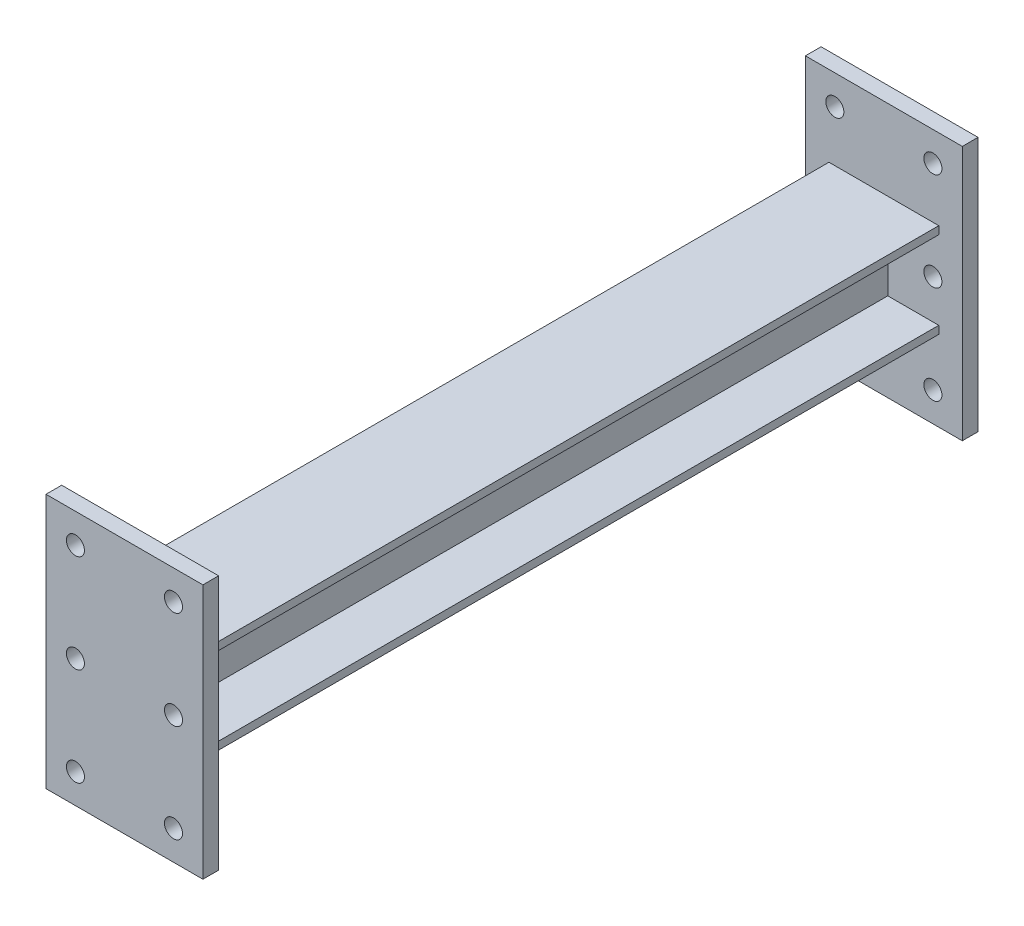
ISO-10303-21;
HEADER;
FILE_DESCRIPTION(('STEP AP214'),'2;1');
FILE_NAME('part.step','',(''),(''),'','','');
FILE_SCHEMA(('AUTOMOTIVE_DESIGN { 1 0 10303 214 1 1 1 1 }'));
ENDSEC;
DATA;
#1=APPLICATION_CONTEXT('core data for automotive mechanical design processes');
#2=APPLICATION_PROTOCOL_DEFINITION('international standard','automotive_design',2000,#1);
#3=PRODUCT_CONTEXT('',#1,'mechanical');
#4=PRODUCT('Part','Part','',(#3));
#5=PRODUCT_RELATED_PRODUCT_CATEGORY('part','',(#4));
#6=PRODUCT_DEFINITION_FORMATION('','',#4);
#7=PRODUCT_DEFINITION_CONTEXT('part definition',#1,'design');
#8=PRODUCT_DEFINITION('design','',#6,#7);
#9=PRODUCT_DEFINITION_SHAPE('','',#8);
#10=(LENGTH_UNIT() NAMED_UNIT(*) SI_UNIT(.MILLI.,.METRE.));
#11=(NAMED_UNIT(*) PLANE_ANGLE_UNIT() SI_UNIT($,.RADIAN.));
#12=(NAMED_UNIT(*) SI_UNIT($,.STERADIAN.) SOLID_ANGLE_UNIT());
#13=UNCERTAINTY_MEASURE_WITH_UNIT(LENGTH_MEASURE(1.E-05),#10,'distance_accuracy_value','');
#14=(GEOMETRIC_REPRESENTATION_CONTEXT(3) GLOBAL_UNCERTAINTY_ASSIGNED_CONTEXT((#13)) GLOBAL_UNIT_ASSIGNED_CONTEXT((#10,
#11,#12)) REPRESENTATION_CONTEXT('',''));
#15=CARTESIAN_POINT('',(0.,0.,0.));
#16=DIRECTION('',(0.,0.,1.));
#17=DIRECTION('',(1.,0.,0.));
#18=AXIS2_PLACEMENT_3D('',#15,#16,#17);
#19=CARTESIAN_POINT('',(0.,9.99999999999999,948.));
#20=DIRECTION('',(1.,0.,0.));
#21=DIRECTION('',(0.,0.,-1.));
#22=AXIS2_PLACEMENT_3D('',#19,#20,#21);
#23=PLANE('',#22);
#24=DIRECTION('',(0.,-1.,0.));
#25=VECTOR('',#24,1.);
#26=CARTESIAN_POINT('',(0.,9.99999999999999,0.));
#27=LINE('',#26,#25);
#28=CARTESIAN_POINT('',(0.,9.99999999999999,0.));
#29=VERTEX_POINT('',#28);
#30=CARTESIAN_POINT('',(0.,0.,0.));
#31=VERTEX_POINT('',#30);
#32=EDGE_CURVE('E227',#29,#31,#27,.T.);
#33=ORIENTED_EDGE('',*,*,#32,.T.);
#34=DIRECTION('',(0.,0.,-1.));
#35=VECTOR('',#34,1.);
#36=CARTESIAN_POINT('',(0.,0.,948.));
#37=LINE('',#36,#35);
#38=CARTESIAN_POINT('',(0.,0.,948.));
#39=VERTEX_POINT('',#38);
#40=EDGE_CURVE('E11',#39,#31,#37,.T.);
#41=ORIENTED_EDGE('',*,*,#40,.F.);
#42=DIRECTION('',(0.,-1.,0.));
#43=VECTOR('',#42,1.);
#44=CARTESIAN_POINT('',(0.,9.99999999999999,948.));
#45=LINE('',#44,#43);
#46=CARTESIAN_POINT('',(0.,9.99999999999999,948.));
#47=VERTEX_POINT('',#46);
#48=EDGE_CURVE('E228',#47,#39,#45,.T.);
#49=ORIENTED_EDGE('',*,*,#48,.F.);
#50=DIRECTION('',(0.,0.,-1.));
#51=VECTOR('',#50,1.);
#52=CARTESIAN_POINT('',(0.,9.99999999999999,948.));
#53=LINE('',#52,#51);
#54=EDGE_CURVE('E265',#47,#29,#53,.T.);
#55=ORIENTED_EDGE('',*,*,#54,.T.);
#56=EDGE_LOOP('',(#33,#41,#49,#55));
#57=FACE_BOUND('',#56,.T.);
#58=ADVANCED_FACE('F34',(#57),#23,.F.);
#59=CARTESIAN_POINT('',(0.,0.,948.));
#60=DIRECTION('',(0.,1.,0.));
#61=DIRECTION('',(0.,0.,1.));
#62=AXIS2_PLACEMENT_3D('',#59,#60,#61);
#63=PLANE('',#62);
#64=DIRECTION('',(1.,0.,0.));
#65=VECTOR('',#64,1.);
#66=CARTESIAN_POINT('',(0.,0.,0.));
#67=LINE('',#66,#65);
#68=CARTESIAN_POINT('',(140.,0.,0.));
#69=VERTEX_POINT('',#68);
#70=EDGE_CURVE('E268',#31,#69,#67,.T.);
#71=ORIENTED_EDGE('',*,*,#70,.T.);
#72=DIRECTION('',(0.,0.,-1.));
#73=VECTOR('',#72,1.);
#74=CARTESIAN_POINT('',(140.,0.,948.));
#75=LINE('',#74,#73);
#76=CARTESIAN_POINT('',(140.,0.,948.));
#77=VERTEX_POINT('',#76);
#78=EDGE_CURVE('E42',#77,#69,#75,.T.);
#79=ORIENTED_EDGE('',*,*,#78,.F.);
#80=DIRECTION('',(1.,0.,0.));
#81=VECTOR('',#80,1.);
#82=CARTESIAN_POINT('',(0.,0.,948.));
#83=LINE('',#82,#81);
#84=EDGE_CURVE('E231',#39,#77,#83,.T.);
#85=ORIENTED_EDGE('',*,*,#84,.F.);
#86=ORIENTED_EDGE('',*,*,#40,.T.);
#87=EDGE_LOOP('',(#71,#79,#85,#86));
#88=FACE_BOUND('',#87,.T.);
#89=ADVANCED_FACE('F330',(#88),#63,.F.);
#90=CARTESIAN_POINT('',(140.,10.,948.));
#91=DIRECTION('',(-1.,0.,0.));
#92=DIRECTION('',(0.,-1.,0.));
#93=AXIS2_PLACEMENT_3D('',#90,#91,#92);
#94=PLANE('',#93);
#95=DIRECTION('',(0.,1.,0.));
#96=VECTOR('',#95,1.);
#97=CARTESIAN_POINT('',(140.,10.,0.));
#98=LINE('',#97,#96);
#99=CARTESIAN_POINT('',(140.,10.,0.));
#100=VERTEX_POINT('',#99);
#101=EDGE_CURVE('E271',#69,#100,#98,.T.);
#102=ORIENTED_EDGE('',*,*,#101,.T.);
#103=DIRECTION('',(0.,0.,-1.));
#104=VECTOR('',#103,1.);
#105=CARTESIAN_POINT('',(140.,10.,948.));
#106=LINE('',#105,#104);
#107=CARTESIAN_POINT('',(140.,10.,948.));
#108=VERTEX_POINT('',#107);
#109=EDGE_CURVE('E323',#108,#100,#106,.T.);
#110=ORIENTED_EDGE('',*,*,#109,.F.);
#111=DIRECTION('',(0.,1.,0.));
#112=VECTOR('',#111,1.);
#113=CARTESIAN_POINT('',(140.,10.,948.));
#114=LINE('',#113,#112);
#115=EDGE_CURVE('E235',#77,#108,#114,.T.);
#116=ORIENTED_EDGE('',*,*,#115,.F.);
#117=ORIENTED_EDGE('',*,*,#78,.T.);
#118=EDGE_LOOP('',(#102,#110,#116,#117));
#119=FACE_BOUND('',#118,.T.);
#120=ADVANCED_FACE('F328',(#119),#94,.F.);
#121=CARTESIAN_POINT('',(75.,10.,948.));
#122=DIRECTION('',(0.,-1.,0.));
#123=DIRECTION('',(0.,0.,-1.));
#124=AXIS2_PLACEMENT_3D('',#121,#122,#123);
#125=PLANE('',#124);
#126=DIRECTION('',(-1.,0.,0.));
#127=VECTOR('',#126,1.);
#128=CARTESIAN_POINT('',(75.,10.,0.));
#129=LINE('',#128,#127);
#130=CARTESIAN_POINT('',(75.,10.,0.));
#131=VERTEX_POINT('',#130);
#132=EDGE_CURVE('E274',#100,#131,#129,.T.);
#133=ORIENTED_EDGE('',*,*,#132,.T.);
#134=DIRECTION('',(0.,0.,-1.));
#135=VECTOR('',#134,1.);
#136=CARTESIAN_POINT('',(75.,10.,948.));
#137=LINE('',#136,#135);
#138=CARTESIAN_POINT('',(75.,10.,948.));
#139=VERTEX_POINT('',#138);
#140=EDGE_CURVE('E320',#139,#131,#137,.T.);
#141=ORIENTED_EDGE('',*,*,#140,.F.);
#142=DIRECTION('',(-1.,0.,0.));
#143=VECTOR('',#142,1.);
#144=CARTESIAN_POINT('',(75.,10.,948.));
#145=LINE('',#144,#143);
#146=EDGE_CURVE('E238',#108,#139,#145,.T.);
#147=ORIENTED_EDGE('',*,*,#146,.F.);
#148=ORIENTED_EDGE('',*,*,#109,.T.);
#149=EDGE_LOOP('',(#133,#141,#147,#148));
#150=FACE_BOUND('',#149,.T.);
#151=ADVANCED_FACE('F336',(#150),#125,.F.);
#152=CARTESIAN_POINT('',(75.,110.,948.));
#153=DIRECTION('',(-1.,0.,0.));
#154=DIRECTION('',(0.,-1.,0.));
#155=AXIS2_PLACEMENT_3D('',#152,#153,#154);
#156=PLANE('',#155);
#157=DIRECTION('',(0.,1.,0.));
#158=VECTOR('',#157,1.);
#159=CARTESIAN_POINT('',(75.,110.,0.));
#160=LINE('',#159,#158);
#161=CARTESIAN_POINT('',(75.,110.,0.));
#162=VERTEX_POINT('',#161);
#163=EDGE_CURVE('E277',#131,#162,#160,.T.);
#164=ORIENTED_EDGE('',*,*,#163,.T.);
#165=DIRECTION('',(0.,0.,-1.));
#166=VECTOR('',#165,1.);
#167=CARTESIAN_POINT('',(75.,110.,948.));
#168=LINE('',#167,#166);
#169=CARTESIAN_POINT('',(75.,110.,948.));
#170=VERTEX_POINT('',#169);
#171=EDGE_CURVE('E317',#170,#162,#168,.T.);
#172=ORIENTED_EDGE('',*,*,#171,.F.);
#173=DIRECTION('',(0.,1.,0.));
#174=VECTOR('',#173,1.);
#175=CARTESIAN_POINT('',(75.,110.,948.));
#176=LINE('',#175,#174);
#177=EDGE_CURVE('E241',#139,#170,#176,.T.);
#178=ORIENTED_EDGE('',*,*,#177,.F.);
#179=ORIENTED_EDGE('',*,*,#140,.T.);
#180=EDGE_LOOP('',(#164,#172,#178,#179));
#181=FACE_BOUND('',#180,.T.);
#182=ADVANCED_FACE('F340',(#181),#156,.F.);
#183=CARTESIAN_POINT('',(140.,110.,948.));
#184=DIRECTION('',(0.,1.,0.));
#185=DIRECTION('',(-1.,0.,0.));
#186=AXIS2_PLACEMENT_3D('',#183,#184,#185);
#187=PLANE('',#186);
#188=DIRECTION('',(1.,0.,0.));
#189=VECTOR('',#188,1.);
#190=CARTESIAN_POINT('',(140.,110.,0.));
#191=LINE('',#190,#189);
#192=CARTESIAN_POINT('',(140.,110.,0.));
#193=VERTEX_POINT('',#192);
#194=EDGE_CURVE('E280',#162,#193,#191,.T.);
#195=ORIENTED_EDGE('',*,*,#194,.T.);
#196=DIRECTION('',(0.,0.,-1.));
#197=VECTOR('',#196,1.);
#198=CARTESIAN_POINT('',(140.,110.,948.));
#199=LINE('',#198,#197);
#200=CARTESIAN_POINT('',(140.,110.,948.));
#201=VERTEX_POINT('',#200);
#202=EDGE_CURVE('E314',#201,#193,#199,.T.);
#203=ORIENTED_EDGE('',*,*,#202,.F.);
#204=DIRECTION('',(1.,0.,0.));
#205=VECTOR('',#204,1.);
#206=CARTESIAN_POINT('',(140.,110.,948.));
#207=LINE('',#206,#205);
#208=EDGE_CURVE('E244',#170,#201,#207,.T.);
#209=ORIENTED_EDGE('',*,*,#208,.F.);
#210=ORIENTED_EDGE('',*,*,#171,.T.);
#211=EDGE_LOOP('',(#195,#203,#209,#210));
#212=FACE_BOUND('',#211,.T.);
#213=ADVANCED_FACE('F362',(#212),#187,.F.);
#214=CARTESIAN_POINT('',(140.,120.,948.));
#215=DIRECTION('',(-1.,0.,0.));
#216=DIRECTION('',(0.,0.,1.));
#217=AXIS2_PLACEMENT_3D('',#214,#215,#216);
#218=PLANE('',#217);
#219=DIRECTION('',(0.,1.,0.));
#220=VECTOR('',#219,1.);
#221=CARTESIAN_POINT('',(140.,120.,0.));
#222=LINE('',#221,#220);
#223=CARTESIAN_POINT('',(140.,120.,0.));
#224=VERTEX_POINT('',#223);
#225=EDGE_CURVE('E283',#193,#224,#222,.T.);
#226=ORIENTED_EDGE('',*,*,#225,.T.);
#227=DIRECTION('',(0.,0.,-1.));
#228=VECTOR('',#227,1.);
#229=CARTESIAN_POINT('',(140.,120.,948.));
#230=LINE('',#229,#228);
#231=CARTESIAN_POINT('',(140.,120.,948.));
#232=VERTEX_POINT('',#231);
#233=EDGE_CURVE('E311',#232,#224,#230,.T.);
#234=ORIENTED_EDGE('',*,*,#233,.F.);
#235=DIRECTION('',(0.,1.,0.));
#236=VECTOR('',#235,1.);
#237=CARTESIAN_POINT('',(140.,120.,948.));
#238=LINE('',#237,#236);
#239=EDGE_CURVE('E247',#201,#232,#238,.T.);
#240=ORIENTED_EDGE('',*,*,#239,.F.);
#241=ORIENTED_EDGE('',*,*,#202,.T.);
#242=EDGE_LOOP('',(#226,#234,#240,#241));
#243=FACE_BOUND('',#242,.T.);
#244=ADVANCED_FACE('F359',(#243),#218,.F.);
#245=CARTESIAN_POINT('',(0.,120.,948.));
#246=DIRECTION('',(0.,-1.,0.));
#247=DIRECTION('',(1.,0.,0.));
#248=AXIS2_PLACEMENT_3D('',#245,#246,#247);
#249=PLANE('',#248);
#250=DIRECTION('',(-1.,0.,0.));
#251=VECTOR('',#250,1.);
#252=CARTESIAN_POINT('',(0.,120.,0.));
#253=LINE('',#252,#251);
#254=CARTESIAN_POINT('',(0.,120.,0.));
#255=VERTEX_POINT('',#254);
#256=EDGE_CURVE('E286',#224,#255,#253,.T.);
#257=ORIENTED_EDGE('',*,*,#256,.T.);
#258=DIRECTION('',(0.,0.,-1.));
#259=VECTOR('',#258,1.);
#260=CARTESIAN_POINT('',(0.,120.,948.));
#261=LINE('',#260,#259);
#262=CARTESIAN_POINT('',(0.,120.,948.));
#263=VERTEX_POINT('',#262);
#264=EDGE_CURVE('E308',#263,#255,#261,.T.);
#265=ORIENTED_EDGE('',*,*,#264,.F.);
#266=DIRECTION('',(-1.,0.,0.));
#267=VECTOR('',#266,1.);
#268=CARTESIAN_POINT('',(0.,120.,948.));
#269=LINE('',#268,#267);
#270=EDGE_CURVE('E250',#232,#263,#269,.T.);
#271=ORIENTED_EDGE('',*,*,#270,.F.);
#272=ORIENTED_EDGE('',*,*,#233,.T.);
#273=EDGE_LOOP('',(#257,#265,#271,#272));
#274=FACE_BOUND('',#273,.T.);
#275=ADVANCED_FACE('F357',(#274),#249,.F.);
#276=CARTESIAN_POINT('',(0.,120.,948.));
#277=DIRECTION('',(1.,0.,0.));
#278=DIRECTION('',(0.,1.,0.));
#279=AXIS2_PLACEMENT_3D('',#276,#277,#278);
#280=PLANE('',#279);
#281=DIRECTION('',(0.,-1.,0.));
#282=VECTOR('',#281,1.);
#283=CARTESIAN_POINT('',(0.,120.,0.));
#284=LINE('',#283,#282);
#285=CARTESIAN_POINT('',(0.,110.,0.));
#286=VERTEX_POINT('',#285);
#287=EDGE_CURVE('E289',#255,#286,#284,.T.);
#288=ORIENTED_EDGE('',*,*,#287,.T.);
#289=DIRECTION('',(0.,0.,-1.));
#290=VECTOR('',#289,1.);
#291=CARTESIAN_POINT('',(0.,110.,948.));
#292=LINE('',#291,#290);
#293=CARTESIAN_POINT('',(0.,110.,948.));
#294=VERTEX_POINT('',#293);
#295=EDGE_CURVE('E305',#294,#286,#292,.T.);
#296=ORIENTED_EDGE('',*,*,#295,.F.);
#297=DIRECTION('',(0.,-1.,0.));
#298=VECTOR('',#297,1.);
#299=CARTESIAN_POINT('',(0.,120.,948.));
#300=LINE('',#299,#298);
#301=EDGE_CURVE('E253',#263,#294,#300,.T.);
#302=ORIENTED_EDGE('',*,*,#301,.F.);
#303=ORIENTED_EDGE('',*,*,#264,.T.);
#304=EDGE_LOOP('',(#288,#296,#302,#303));
#305=FACE_BOUND('',#304,.T.);
#306=ADVANCED_FACE('F353',(#305),#280,.F.);
#307=CARTESIAN_POINT('',(0.,110.,948.));
#308=DIRECTION('',(0.,1.,0.));
#309=DIRECTION('',(-1.,0.,0.));
#310=AXIS2_PLACEMENT_3D('',#307,#308,#309);
#311=PLANE('',#310);
#312=DIRECTION('',(1.,0.,0.));
#313=VECTOR('',#312,1.);
#314=CARTESIAN_POINT('',(0.,110.,0.));
#315=LINE('',#314,#313);
#316=CARTESIAN_POINT('',(65.,110.,0.));
#317=VERTEX_POINT('',#316);
#318=EDGE_CURVE('E292',#286,#317,#315,.T.);
#319=ORIENTED_EDGE('',*,*,#318,.T.);
#320=DIRECTION('',(0.,0.,-1.));
#321=VECTOR('',#320,1.);
#322=CARTESIAN_POINT('',(65.,110.,948.));
#323=LINE('',#322,#321);
#324=CARTESIAN_POINT('',(65.,110.,948.));
#325=VERTEX_POINT('',#324);
#326=EDGE_CURVE('E302',#325,#317,#323,.T.);
#327=ORIENTED_EDGE('',*,*,#326,.F.);
#328=DIRECTION('',(1.,0.,0.));
#329=VECTOR('',#328,1.);
#330=CARTESIAN_POINT('',(0.,110.,948.));
#331=LINE('',#330,#329);
#332=EDGE_CURVE('E256',#294,#325,#331,.T.);
#333=ORIENTED_EDGE('',*,*,#332,.F.);
#334=ORIENTED_EDGE('',*,*,#295,.T.);
#335=EDGE_LOOP('',(#319,#327,#333,#334));
#336=FACE_BOUND('',#335,.T.);
#337=ADVANCED_FACE('F351',(#336),#311,.F.);
#338=CARTESIAN_POINT('',(65.,110.,948.));
#339=DIRECTION('',(1.,0.,0.));
#340=DIRECTION('',(0.,1.,0.));
#341=AXIS2_PLACEMENT_3D('',#338,#339,#340);
#342=PLANE('',#341);
#343=DIRECTION('',(0.,-1.,0.));
#344=VECTOR('',#343,1.);
#345=CARTESIAN_POINT('',(65.,110.,0.));
#346=LINE('',#345,#344);
#347=CARTESIAN_POINT('',(65.,10.,0.));
#348=VERTEX_POINT('',#347);
#349=EDGE_CURVE('E295',#317,#348,#346,.T.);
#350=ORIENTED_EDGE('',*,*,#349,.T.);
#351=DIRECTION('',(0.,0.,-1.));
#352=VECTOR('',#351,1.);
#353=CARTESIAN_POINT('',(65.,10.,948.));
#354=LINE('',#353,#352);
#355=CARTESIAN_POINT('',(65.,10.,948.));
#356=VERTEX_POINT('',#355);
#357=EDGE_CURVE('E49',#356,#348,#354,.T.);
#358=ORIENTED_EDGE('',*,*,#357,.F.);
#359=DIRECTION('',(0.,-1.,0.));
#360=VECTOR('',#359,1.);
#361=CARTESIAN_POINT('',(65.,110.,948.));
#362=LINE('',#361,#360);
#363=EDGE_CURVE('E259',#325,#356,#362,.T.);
#364=ORIENTED_EDGE('',*,*,#363,.F.);
#365=ORIENTED_EDGE('',*,*,#326,.T.);
#366=EDGE_LOOP('',(#350,#358,#364,#365));
#367=FACE_BOUND('',#366,.T.);
#368=ADVANCED_FACE('F348',(#367),#342,.F.);
#369=CARTESIAN_POINT('',(65.,10.,948.));
#370=DIRECTION('',(0.,-1.,0.));
#371=DIRECTION('',(1.,0.,0.));
#372=AXIS2_PLACEMENT_3D('',#369,#370,#371);
#373=PLANE('',#372);
#374=DIRECTION('',(-1.,0.,0.));
#375=VECTOR('',#374,1.);
#376=CARTESIAN_POINT('',(65.,10.,0.));
#377=LINE('',#376,#375);
#378=EDGE_CURVE('E232',#348,#29,#377,.T.);
#379=ORIENTED_EDGE('',*,*,#378,.T.);
#380=ORIENTED_EDGE('',*,*,#54,.F.);
#381=DIRECTION('',(-1.,0.,0.));
#382=VECTOR('',#381,1.);
#383=CARTESIAN_POINT('',(65.,10.,948.));
#384=LINE('',#383,#382);
#385=EDGE_CURVE('E262',#356,#47,#384,.T.);
#386=ORIENTED_EDGE('',*,*,#385,.F.);
#387=ORIENTED_EDGE('',*,*,#357,.T.);
#388=EDGE_LOOP('',(#379,#380,#386,#387));
#389=FACE_BOUND('',#388,.T.);
#390=ADVANCED_FACE('F347',(#389),#373,.F.);
#391=CARTESIAN_POINT('',(0.,0.,948.));
#392=DIRECTION('',(0.,0.,1.));
#393=DIRECTION('',(1.,0.,0.));
#394=AXIS2_PLACEMENT_3D('',#391,#392,#393);
#395=PLANE('',#394);
#396=CARTESIAN_POINT('',(132.5,-64.9999999999999,948.));
#397=DIRECTION('',(0.,0.,1.));
#398=DIRECTION('',(1.,0.,0.));
#399=AXIS2_PLACEMENT_3D('',#396,#397,#398);
#400=CIRCLE('',#399,11.5);
#401=CARTESIAN_POINT('',(144.,-64.9999999999999,948.));
#402=VERTEX_POINT('',#401);
#403=EDGE_CURVE('E702',#402,#402,#400,.T.);
#404=ORIENTED_EDGE('',*,*,#403,.T.);
#405=EDGE_LOOP('',(#404));
#406=FACE_BOUND('',#405,.T.);
#407=CARTESIAN_POINT('',(132.5,60.0000000000001,948.));
#408=DIRECTION('',(0.,0.,1.));
#409=DIRECTION('',(1.,0.,0.));
#410=AXIS2_PLACEMENT_3D('',#407,#408,#409);
#411=CIRCLE('',#410,11.5);
#412=CARTESIAN_POINT('',(144.,60.0000000000001,948.));
#413=VERTEX_POINT('',#412);
#414=EDGE_CURVE('E719',#413,#413,#411,.T.);
#415=ORIENTED_EDGE('',*,*,#414,.T.);
#416=EDGE_LOOP('',(#415));
#417=FACE_BOUND('',#416,.T.);
#418=CARTESIAN_POINT('',(132.5,185.,948.));
#419=DIRECTION('',(0.,0.,1.));
#420=DIRECTION('',(1.,0.,0.));
#421=AXIS2_PLACEMENT_3D('',#418,#419,#420);
#422=CIRCLE('',#421,11.5);
#423=CARTESIAN_POINT('',(144.,185.,948.));
#424=VERTEX_POINT('',#423);
#425=EDGE_CURVE('E731',#424,#424,#422,.T.);
#426=ORIENTED_EDGE('',*,*,#425,.T.);
#427=EDGE_LOOP('',(#426));
#428=FACE_BOUND('',#427,.T.);
#429=CARTESIAN_POINT('',(7.49999999999987,-65.,948.));
#430=DIRECTION('',(0.,0.,1.));
#431=DIRECTION('',(1.,0.,0.));
#432=AXIS2_PLACEMENT_3D('',#429,#430,#431);
#433=CIRCLE('',#432,11.5);
#434=CARTESIAN_POINT('',(18.9999999999999,-65.,948.));
#435=VERTEX_POINT('',#434);
#436=EDGE_CURVE('E743',#435,#435,#433,.T.);
#437=ORIENTED_EDGE('',*,*,#436,.T.);
#438=EDGE_LOOP('',(#437));
#439=FACE_BOUND('',#438,.T.);
#440=CARTESIAN_POINT('',(7.49999999999991,60.,948.));
#441=DIRECTION('',(0.,0.,1.));
#442=DIRECTION('',(1.,0.,0.));
#443=AXIS2_PLACEMENT_3D('',#440,#441,#442);
#444=CIRCLE('',#443,11.5);
#445=CARTESIAN_POINT('',(18.9999999999999,60.,948.));
#446=VERTEX_POINT('',#445);
#447=EDGE_CURVE('E755',#446,#446,#444,.T.);
#448=ORIENTED_EDGE('',*,*,#447,.T.);
#449=EDGE_LOOP('',(#448));
#450=FACE_BOUND('',#449,.T.);
#451=CARTESIAN_POINT('',(7.49999999999995,185.,948.));
#452=DIRECTION('',(0.,0.,1.));
#453=DIRECTION('',(1.,0.,0.));
#454=AXIS2_PLACEMENT_3D('',#451,#452,#453);
#455=CIRCLE('',#454,11.5);
#456=CARTESIAN_POINT('',(19.,185.,948.));
#457=VERTEX_POINT('',#456);
#458=EDGE_CURVE('E767',#457,#457,#455,.T.);
#459=ORIENTED_EDGE('',*,*,#458,.T.);
#460=EDGE_LOOP('',(#459));
#461=FACE_BOUND('',#460,.T.);
#462=DIRECTION('',(0.,-1.,0.));
#463=VECTOR('',#462,1.);
#464=CARTESIAN_POINT('',(-29.9999999999999,222.5,948.));
#465=LINE('',#464,#463);
#466=CARTESIAN_POINT('',(-29.9999999999999,222.5,948.));
#467=VERTEX_POINT('',#466);
#468=CARTESIAN_POINT('',(-30.0000000000001,-102.5,948.));
#469=VERTEX_POINT('',#468);
#470=EDGE_CURVE('E192',#467,#469,#465,.T.);
#471=ORIENTED_EDGE('',*,*,#470,.F.);
#472=DIRECTION('',(-1.,0.,0.));
#473=VECTOR('',#472,1.);
#474=CARTESIAN_POINT('',(-29.9999999999999,222.5,948.));
#475=LINE('',#474,#473);
#476=CARTESIAN_POINT('',(170.,222.5,948.));
#477=VERTEX_POINT('',#476);
#478=EDGE_CURVE('E205',#477,#467,#475,.T.);
#479=ORIENTED_EDGE('',*,*,#478,.F.);
#480=DIRECTION('',(0.,1.,0.));
#481=VECTOR('',#480,1.);
#482=CARTESIAN_POINT('',(170.,222.5,948.));
#483=LINE('',#482,#481);
#484=CARTESIAN_POINT('',(170.,-102.5,948.));
#485=VERTEX_POINT('',#484);
#486=EDGE_CURVE('E213',#485,#477,#483,.T.);
#487=ORIENTED_EDGE('',*,*,#486,.F.);
#488=DIRECTION('',(1.,0.,0.));
#489=VECTOR('',#488,1.);
#490=CARTESIAN_POINT('',(-30.0000000000001,-102.5,948.));
#491=LINE('',#490,#489);
#492=EDGE_CURVE('E195',#469,#485,#491,.T.);
#493=ORIENTED_EDGE('',*,*,#492,.F.);
#494=EDGE_LOOP('',(#471,#479,#487,#493));
#495=FACE_BOUND('',#494,.T.);
#496=ORIENTED_EDGE('',*,*,#385,.T.);
#497=ORIENTED_EDGE('',*,*,#48,.T.);
#498=ORIENTED_EDGE('',*,*,#84,.T.);
#499=ORIENTED_EDGE('',*,*,#115,.T.);
#500=ORIENTED_EDGE('',*,*,#146,.T.);
#501=ORIENTED_EDGE('',*,*,#177,.T.);
#502=ORIENTED_EDGE('',*,*,#208,.T.);
#503=ORIENTED_EDGE('',*,*,#239,.T.);
#504=ORIENTED_EDGE('',*,*,#270,.T.);
#505=ORIENTED_EDGE('',*,*,#301,.T.);
#506=ORIENTED_EDGE('',*,*,#332,.T.);
#507=ORIENTED_EDGE('',*,*,#363,.T.);
#508=EDGE_LOOP('',(#496,#497,#498,#499,#500,#501,#502,#503,#504,#505,#506,#507));
#509=FACE_BOUND('',#508,.T.);
#510=ADVANCED_FACE('F343',(#406,#417,#428,#439,#450,#461,#495,#509),#395,.F.);
#511=CARTESIAN_POINT('',(-29.9999999999999,222.5,968.));
#512=DIRECTION('',(1.,0.,0.));
#513=DIRECTION('',(0.,1.,0.));
#514=AXIS2_PLACEMENT_3D('',#511,#512,#513);
#515=PLANE('',#514);
#516=ORIENTED_EDGE('',*,*,#470,.T.);
#517=DIRECTION('',(0.,0.,-1.));
#518=VECTOR('',#517,1.);
#519=CARTESIAN_POINT('',(-30.0000000000001,-102.5,968.));
#520=LINE('',#519,#518);
#521=CARTESIAN_POINT('',(-30.0000000000001,-102.5,968.));
#522=VERTEX_POINT('',#521);
#523=EDGE_CURVE('E224',#522,#469,#520,.T.);
#524=ORIENTED_EDGE('',*,*,#523,.F.);
#525=DIRECTION('',(0.,-1.,0.));
#526=VECTOR('',#525,1.);
#527=CARTESIAN_POINT('',(-29.9999999999999,222.5,968.));
#528=LINE('',#527,#526);
#529=CARTESIAN_POINT('',(-29.9999999999999,222.5,968.));
#530=VERTEX_POINT('',#529);
#531=EDGE_CURVE('E201',#530,#522,#528,.T.);
#532=ORIENTED_EDGE('',*,*,#531,.F.);
#533=DIRECTION('',(0.,0.,-1.));
#534=VECTOR('',#533,1.);
#535=CARTESIAN_POINT('',(-29.9999999999999,222.5,968.));
#536=LINE('',#535,#534);
#537=EDGE_CURVE('E210',#530,#467,#536,.T.);
#538=ORIENTED_EDGE('',*,*,#537,.T.);
#539=EDGE_LOOP('',(#516,#524,#532,#538));
#540=FACE_BOUND('',#539,.T.);
#541=ADVANCED_FACE('F510',(#540),#515,.F.);
#542=CARTESIAN_POINT('',(-30.0000000000001,-102.5,968.));
#543=DIRECTION('',(0.,1.,0.));
#544=DIRECTION('',(0.,0.,1.));
#545=AXIS2_PLACEMENT_3D('',#542,#543,#544);
#546=PLANE('',#545);
#547=ORIENTED_EDGE('',*,*,#492,.T.);
#548=DIRECTION('',(0.,0.,-1.));
#549=VECTOR('',#548,1.);
#550=CARTESIAN_POINT('',(170.,-102.5,968.));
#551=LINE('',#550,#549);
#552=CARTESIAN_POINT('',(170.,-102.5,968.));
#553=VERTEX_POINT('',#552);
#554=EDGE_CURVE('E221',#553,#485,#551,.T.);
#555=ORIENTED_EDGE('',*,*,#554,.F.);
#556=DIRECTION('',(1.,0.,0.));
#557=VECTOR('',#556,1.);
#558=CARTESIAN_POINT('',(-30.0000000000001,-102.5,968.));
#559=LINE('',#558,#557);
#560=EDGE_CURVE('E204',#522,#553,#559,.T.);
#561=ORIENTED_EDGE('',*,*,#560,.F.);
#562=ORIENTED_EDGE('',*,*,#523,.T.);
#563=EDGE_LOOP('',(#547,#555,#561,#562));
#564=FACE_BOUND('',#563,.T.);
#565=ADVANCED_FACE('F644',(#564),#546,.F.);
#566=CARTESIAN_POINT('',(170.,222.5,968.));
#567=DIRECTION('',(-1.,0.,0.));
#568=DIRECTION('',(0.,0.,1.));
#569=AXIS2_PLACEMENT_3D('',#566,#567,#568);
#570=PLANE('',#569);
#571=ORIENTED_EDGE('',*,*,#486,.T.);
#572=DIRECTION('',(0.,0.,-1.));
#573=VECTOR('',#572,1.);
#574=CARTESIAN_POINT('',(170.,222.5,968.));
#575=LINE('',#574,#573);
#576=CARTESIAN_POINT('',(170.,222.5,968.));
#577=VERTEX_POINT('',#576);
#578=EDGE_CURVE('E218',#577,#477,#575,.T.);
#579=ORIENTED_EDGE('',*,*,#578,.F.);
#580=DIRECTION('',(0.,1.,0.));
#581=VECTOR('',#580,1.);
#582=CARTESIAN_POINT('',(170.,222.5,968.));
#583=LINE('',#582,#581);
#584=EDGE_CURVE('E207',#553,#577,#583,.T.);
#585=ORIENTED_EDGE('',*,*,#584,.F.);
#586=ORIENTED_EDGE('',*,*,#554,.T.);
#587=EDGE_LOOP('',(#571,#579,#585,#586));
#588=FACE_BOUND('',#587,.T.);
#589=ADVANCED_FACE('F640',(#588),#570,.F.);
#590=CARTESIAN_POINT('',(-29.9999999999999,222.5,968.));
#591=DIRECTION('',(0.,-1.,0.));
#592=DIRECTION('',(1.,0.,0.));
#593=AXIS2_PLACEMENT_3D('',#590,#591,#592);
#594=PLANE('',#593);
#595=ORIENTED_EDGE('',*,*,#478,.T.);
#596=ORIENTED_EDGE('',*,*,#537,.F.);
#597=DIRECTION('',(-1.,0.,0.));
#598=VECTOR('',#597,1.);
#599=CARTESIAN_POINT('',(-29.9999999999999,222.5,968.));
#600=LINE('',#599,#598);
#601=EDGE_CURVE('E209',#577,#530,#600,.T.);
#602=ORIENTED_EDGE('',*,*,#601,.F.);
#603=ORIENTED_EDGE('',*,*,#578,.T.);
#604=EDGE_LOOP('',(#595,#596,#602,#603));
#605=FACE_BOUND('',#604,.T.);
#606=ADVANCED_FACE('F523',(#605),#594,.F.);
#607=CARTESIAN_POINT('',(0.,0.,968.));
#608=DIRECTION('',(0.,0.,1.));
#609=DIRECTION('',(1.,0.,0.));
#610=AXIS2_PLACEMENT_3D('',#607,#608,#609);
#611=PLANE('',#610);
#612=CARTESIAN_POINT('',(132.5,-64.9999999999999,968.));
#613=DIRECTION('',(0.,0.,1.));
#614=DIRECTION('',(1.,0.,0.));
#615=AXIS2_PLACEMENT_3D('',#612,#613,#614);
#616=CIRCLE('',#615,11.5);
#617=CARTESIAN_POINT('',(144.,-64.9999999999999,968.));
#618=VERTEX_POINT('',#617);
#619=EDGE_CURVE('E699',#618,#618,#616,.T.);
#620=ORIENTED_EDGE('',*,*,#619,.F.);
#621=EDGE_LOOP('',(#620));
#622=FACE_BOUND('',#621,.T.);
#623=CARTESIAN_POINT('',(132.5,60.0000000000001,968.));
#624=DIRECTION('',(0.,0.,1.));
#625=DIRECTION('',(1.,0.,0.));
#626=AXIS2_PLACEMENT_3D('',#623,#624,#625);
#627=CIRCLE('',#626,11.5);
#628=CARTESIAN_POINT('',(144.,60.0000000000001,968.));
#629=VERTEX_POINT('',#628);
#630=EDGE_CURVE('E703',#629,#629,#627,.T.);
#631=ORIENTED_EDGE('',*,*,#630,.F.);
#632=EDGE_LOOP('',(#631));
#633=FACE_BOUND('',#632,.T.);
#634=CARTESIAN_POINT('',(132.5,185.,968.));
#635=DIRECTION('',(0.,0.,1.));
#636=DIRECTION('',(1.,0.,0.));
#637=AXIS2_PLACEMENT_3D('',#634,#635,#636);
#638=CIRCLE('',#637,11.5);
#639=CARTESIAN_POINT('',(144.,185.,968.));
#640=VERTEX_POINT('',#639);
#641=EDGE_CURVE('E722',#640,#640,#638,.T.);
#642=ORIENTED_EDGE('',*,*,#641,.F.);
#643=EDGE_LOOP('',(#642));
#644=FACE_BOUND('',#643,.T.);
#645=CARTESIAN_POINT('',(7.49999999999987,-65.,968.));
#646=DIRECTION('',(0.,0.,1.));
#647=DIRECTION('',(1.,0.,0.));
#648=AXIS2_PLACEMENT_3D('',#645,#646,#647);
#649=CIRCLE('',#648,11.5);
#650=CARTESIAN_POINT('',(18.9999999999999,-65.,968.));
#651=VERTEX_POINT('',#650);
#652=EDGE_CURVE('E734',#651,#651,#649,.T.);
#653=ORIENTED_EDGE('',*,*,#652,.F.);
#654=EDGE_LOOP('',(#653));
#655=FACE_BOUND('',#654,.T.);
#656=CARTESIAN_POINT('',(7.49999999999991,60.,968.));
#657=DIRECTION('',(0.,0.,1.));
#658=DIRECTION('',(1.,0.,0.));
#659=AXIS2_PLACEMENT_3D('',#656,#657,#658);
#660=CIRCLE('',#659,11.5);
#661=CARTESIAN_POINT('',(18.9999999999999,60.,968.));
#662=VERTEX_POINT('',#661);
#663=EDGE_CURVE('E746',#662,#662,#660,.T.);
#664=ORIENTED_EDGE('',*,*,#663,.F.);
#665=EDGE_LOOP('',(#664));
#666=FACE_BOUND('',#665,.T.);
#667=CARTESIAN_POINT('',(7.49999999999995,185.,968.));
#668=DIRECTION('',(0.,0.,1.));
#669=DIRECTION('',(1.,0.,0.));
#670=AXIS2_PLACEMENT_3D('',#667,#668,#669);
#671=CIRCLE('',#670,11.5);
#672=CARTESIAN_POINT('',(19.,185.,968.));
#673=VERTEX_POINT('',#672);
#674=EDGE_CURVE('E758',#673,#673,#671,.T.);
#675=ORIENTED_EDGE('',*,*,#674,.F.);
#676=EDGE_LOOP('',(#675));
#677=FACE_BOUND('',#676,.T.);
#678=ORIENTED_EDGE('',*,*,#531,.T.);
#679=ORIENTED_EDGE('',*,*,#560,.T.);
#680=ORIENTED_EDGE('',*,*,#584,.T.);
#681=ORIENTED_EDGE('',*,*,#601,.T.);
#682=EDGE_LOOP('',(#678,#679,#680,#681));
#683=FACE_BOUND('',#682,.T.);
#684=ADVANCED_FACE('F518',(#622,#633,#644,#655,#666,#677,#683),#611,.T.);
#685=CARTESIAN_POINT('',(0.,0.,0.));
#686=DIRECTION('',(0.,0.,-1.));
#687=DIRECTION('',(-1.,0.,0.));
#688=AXIS2_PLACEMENT_3D('',#685,#686,#687);
#689=PLANE('',#688);
#690=CARTESIAN_POINT('',(132.5,-64.9999999999999,0.));
#691=DIRECTION('',(0.,0.,-1.));
#692=DIRECTION('',(-1.,0.,0.));
#693=AXIS2_PLACEMENT_3D('',#690,#691,#692);
#694=CIRCLE('',#693,11.5);
#695=CARTESIAN_POINT('',(121.,-64.9999999999999,0.));
#696=VERTEX_POINT('',#695);
#697=EDGE_CURVE('E704',#696,#696,#694,.T.);
#698=ORIENTED_EDGE('',*,*,#697,.T.);
#699=EDGE_LOOP('',(#698));
#700=FACE_BOUND('',#699,.T.);
#701=CARTESIAN_POINT('',(132.5,60.0000000000001,0.));
#702=DIRECTION('',(0.,0.,-1.));
#703=DIRECTION('',(-1.,0.,0.));
#704=AXIS2_PLACEMENT_3D('',#701,#702,#703);
#705=CIRCLE('',#704,11.5);
#706=CARTESIAN_POINT('',(121.,60.0000000000001,0.));
#707=VERTEX_POINT('',#706);
#708=EDGE_CURVE('E715',#707,#707,#705,.T.);
#709=ORIENTED_EDGE('',*,*,#708,.T.);
#710=EDGE_LOOP('',(#709));
#711=FACE_BOUND('',#710,.T.);
#712=CARTESIAN_POINT('',(132.5,185.,0.));
#713=DIRECTION('',(0.,0.,-1.));
#714=DIRECTION('',(-1.,0.,0.));
#715=AXIS2_PLACEMENT_3D('',#712,#713,#714);
#716=CIRCLE('',#715,11.5);
#717=CARTESIAN_POINT('',(121.,185.,0.));
#718=VERTEX_POINT('',#717);
#719=EDGE_CURVE('E726',#718,#718,#716,.T.);
#720=ORIENTED_EDGE('',*,*,#719,.T.);
#721=EDGE_LOOP('',(#720));
#722=FACE_BOUND('',#721,.T.);
#723=CARTESIAN_POINT('',(7.49999999999987,-65.,0.));
#724=DIRECTION('',(0.,0.,-1.));
#725=DIRECTION('',(-1.,0.,0.));
#726=AXIS2_PLACEMENT_3D('',#723,#724,#725);
#727=CIRCLE('',#726,11.5);
#728=CARTESIAN_POINT('',(-4.00000000000015,-65.,0.));
#729=VERTEX_POINT('',#728);
#730=EDGE_CURVE('E738',#729,#729,#727,.T.);
#731=ORIENTED_EDGE('',*,*,#730,.T.);
#732=EDGE_LOOP('',(#731));
#733=FACE_BOUND('',#732,.T.);
#734=CARTESIAN_POINT('',(7.49999999999991,60.,0.));
#735=DIRECTION('',(0.,0.,-1.));
#736=DIRECTION('',(-1.,0.,0.));
#737=AXIS2_PLACEMENT_3D('',#734,#735,#736);
#738=CIRCLE('',#737,11.5);
#739=CARTESIAN_POINT('',(-4.0000000000001,60.,0.));
#740=VERTEX_POINT('',#739);
#741=EDGE_CURVE('E750',#740,#740,#738,.T.);
#742=ORIENTED_EDGE('',*,*,#741,.T.);
#743=EDGE_LOOP('',(#742));
#744=FACE_BOUND('',#743,.T.);
#745=CARTESIAN_POINT('',(7.49999999999995,185.,0.));
#746=DIRECTION('',(0.,0.,-1.));
#747=DIRECTION('',(-1.,0.,0.));
#748=AXIS2_PLACEMENT_3D('',#745,#746,#747);
#749=CIRCLE('',#748,11.5);
#750=CARTESIAN_POINT('',(-4.00000000000006,185.,0.));
#751=VERTEX_POINT('',#750);
#752=EDGE_CURVE('E762',#751,#751,#749,.T.);
#753=ORIENTED_EDGE('',*,*,#752,.T.);
#754=EDGE_LOOP('',(#753));
#755=FACE_BOUND('',#754,.T.);
#756=DIRECTION('',(0.,-1.,0.));
#757=VECTOR('',#756,1.);
#758=CARTESIAN_POINT('',(170.,222.5,0.));
#759=LINE('',#758,#757);
#760=CARTESIAN_POINT('',(170.,222.5,0.));
#761=VERTEX_POINT('',#760);
#762=CARTESIAN_POINT('',(170.,-102.5,0.));
#763=VERTEX_POINT('',#762);
#764=EDGE_CURVE('E191',#761,#763,#759,.T.);
#765=ORIENTED_EDGE('',*,*,#764,.F.);
#766=DIRECTION('',(1.,0.,0.));
#767=VECTOR('',#766,1.);
#768=CARTESIAN_POINT('',(170.,222.5,0.));
#769=LINE('',#768,#767);
#770=CARTESIAN_POINT('',(-30.0000000000001,222.5,0.));
#771=VERTEX_POINT('',#770);
#772=EDGE_CURVE('E187',#771,#761,#769,.T.);
#773=ORIENTED_EDGE('',*,*,#772,.F.);
#774=DIRECTION('',(0.,1.,0.));
#775=VECTOR('',#774,1.);
#776=CARTESIAN_POINT('',(-30.0000000000001,222.5,0.));
#777=LINE('',#776,#775);
#778=CARTESIAN_POINT('',(-30.0000000000001,-102.5,0.));
#779=VERTEX_POINT('',#778);
#780=EDGE_CURVE('E776',#779,#771,#777,.T.);
#781=ORIENTED_EDGE('',*,*,#780,.F.);
#782=DIRECTION('',(-1.,0.,0.));
#783=VECTOR('',#782,1.);
#784=CARTESIAN_POINT('',(170.,-102.5,0.));
#785=LINE('',#784,#783);
#786=EDGE_CURVE('E774',#763,#779,#785,.T.);
#787=ORIENTED_EDGE('',*,*,#786,.F.);
#788=EDGE_LOOP('',(#765,#773,#781,#787));
#789=FACE_BOUND('',#788,.T.);
#790=ORIENTED_EDGE('',*,*,#70,.F.);
#791=ORIENTED_EDGE('',*,*,#32,.F.);
#792=ORIENTED_EDGE('',*,*,#378,.F.);
#793=ORIENTED_EDGE('',*,*,#349,.F.);
#794=ORIENTED_EDGE('',*,*,#318,.F.);
#795=ORIENTED_EDGE('',*,*,#287,.F.);
#796=ORIENTED_EDGE('',*,*,#256,.F.);
#797=ORIENTED_EDGE('',*,*,#225,.F.);
#798=ORIENTED_EDGE('',*,*,#194,.F.);
#799=ORIENTED_EDGE('',*,*,#163,.F.);
#800=ORIENTED_EDGE('',*,*,#132,.F.);
#801=ORIENTED_EDGE('',*,*,#101,.F.);
#802=EDGE_LOOP('',(#790,#791,#792,#793,#794,#795,#796,#797,#798,#799,#800,#801));
#803=FACE_BOUND('',#802,.T.);
#804=ADVANCED_FACE('F334',(#700,#711,#722,#733,#744,#755,#789,#803),#689,.F.);
#805=CARTESIAN_POINT('',(170.,222.5,-20.));
#806=DIRECTION('',(-1.,0.,0.));
#807=DIRECTION('',(0.,0.,1.));
#808=AXIS2_PLACEMENT_3D('',#805,#806,#807);
#809=PLANE('',#808);
#810=ORIENTED_EDGE('',*,*,#764,.T.);
#811=DIRECTION('',(0.,0.,1.));
#812=VECTOR('',#811,1.);
#813=CARTESIAN_POINT('',(170.,-102.5,-20.));
#814=LINE('',#813,#812);
#815=CARTESIAN_POINT('',(170.,-102.5,-20.));
#816=VERTEX_POINT('',#815);
#817=EDGE_CURVE('E171',#816,#763,#814,.T.);
#818=ORIENTED_EDGE('',*,*,#817,.F.);
#819=DIRECTION('',(0.,-1.,0.));
#820=VECTOR('',#819,1.);
#821=CARTESIAN_POINT('',(170.,222.5,-20.));
#822=LINE('',#821,#820);
#823=CARTESIAN_POINT('',(170.,222.5,-20.));
#824=VERTEX_POINT('',#823);
#825=EDGE_CURVE('E178',#824,#816,#822,.T.);
#826=ORIENTED_EDGE('',*,*,#825,.F.);
#827=DIRECTION('',(0.,0.,1.));
#828=VECTOR('',#827,1.);
#829=CARTESIAN_POINT('',(170.,222.5,-20.));
#830=LINE('',#829,#828);
#831=EDGE_CURVE('E772',#824,#761,#830,.T.);
#832=ORIENTED_EDGE('',*,*,#831,.T.);
#833=EDGE_LOOP('',(#810,#818,#826,#832));
#834=FACE_BOUND('',#833,.T.);
#835=ADVANCED_FACE('F189',(#834),#809,.F.);
#836=CARTESIAN_POINT('',(170.,-102.5,-20.));
#837=DIRECTION('',(0.,1.,0.));
#838=DIRECTION('',(0.,0.,1.));
#839=AXIS2_PLACEMENT_3D('',#836,#837,#838);
#840=PLANE('',#839);
#841=ORIENTED_EDGE('',*,*,#786,.T.);
#842=DIRECTION('',(0.,0.,1.));
#843=VECTOR('',#842,1.);
#844=CARTESIAN_POINT('',(-30.0000000000001,-102.5,-20.));
#845=LINE('',#844,#843);
#846=CARTESIAN_POINT('',(-30.0000000000001,-102.5,-20.));
#847=VERTEX_POINT('',#846);
#848=EDGE_CURVE('E174',#847,#779,#845,.T.);
#849=ORIENTED_EDGE('',*,*,#848,.F.);
#850=DIRECTION('',(-1.,0.,0.));
#851=VECTOR('',#850,1.);
#852=CARTESIAN_POINT('',(170.,-102.5,-20.));
#853=LINE('',#852,#851);
#854=EDGE_CURVE('E167',#816,#847,#853,.T.);
#855=ORIENTED_EDGE('',*,*,#854,.F.);
#856=ORIENTED_EDGE('',*,*,#817,.T.);
#857=EDGE_LOOP('',(#841,#849,#855,#856));
#858=FACE_BOUND('',#857,.T.);
#859=ADVANCED_FACE('F169',(#858),#840,.F.);
#860=CARTESIAN_POINT('',(-30.0000000000001,222.5,-20.));
#861=DIRECTION('',(1.,0.,0.));
#862=DIRECTION('',(0.,0.,-1.));
#863=AXIS2_PLACEMENT_3D('',#860,#861,#862);
#864=PLANE('',#863);
#865=ORIENTED_EDGE('',*,*,#780,.T.);
#866=DIRECTION('',(0.,0.,1.));
#867=VECTOR('',#866,1.);
#868=CARTESIAN_POINT('',(-30.0000000000001,222.5,-20.));
#869=LINE('',#868,#867);
#870=CARTESIAN_POINT('',(-30.0000000000001,222.5,-20.));
#871=VERTEX_POINT('',#870);
#872=EDGE_CURVE('E197',#871,#771,#869,.T.);
#873=ORIENTED_EDGE('',*,*,#872,.F.);
#874=DIRECTION('',(0.,1.,0.));
#875=VECTOR('',#874,1.);
#876=CARTESIAN_POINT('',(-30.0000000000001,222.5,-20.));
#877=LINE('',#876,#875);
#878=EDGE_CURVE('E177',#847,#871,#877,.T.);
#879=ORIENTED_EDGE('',*,*,#878,.F.);
#880=ORIENTED_EDGE('',*,*,#848,.T.);
#881=EDGE_LOOP('',(#865,#873,#879,#880));
#882=FACE_BOUND('',#881,.T.);
#883=ADVANCED_FACE('F460',(#882),#864,.F.);
#884=CARTESIAN_POINT('',(170.,222.5,-20.));
#885=DIRECTION('',(0.,-1.,0.));
#886=DIRECTION('',(0.,0.,-1.));
#887=AXIS2_PLACEMENT_3D('',#884,#885,#886);
#888=PLANE('',#887);
#889=ORIENTED_EDGE('',*,*,#772,.T.);
#890=ORIENTED_EDGE('',*,*,#831,.F.);
#891=DIRECTION('',(1.,0.,0.));
#892=VECTOR('',#891,1.);
#893=CARTESIAN_POINT('',(170.,222.5,-20.));
#894=LINE('',#893,#892);
#895=EDGE_CURVE('E183',#871,#824,#894,.T.);
#896=ORIENTED_EDGE('',*,*,#895,.F.);
#897=ORIENTED_EDGE('',*,*,#872,.T.);
#898=EDGE_LOOP('',(#889,#890,#896,#897));
#899=FACE_BOUND('',#898,.T.);
#900=ADVANCED_FACE('F469',(#899),#888,.F.);
#901=CARTESIAN_POINT('',(0.,0.,-20.));
#902=DIRECTION('',(0.,0.,-1.));
#903=DIRECTION('',(-1.,0.,0.));
#904=AXIS2_PLACEMENT_3D('',#901,#902,#903);
#905=PLANE('',#904);
#906=CARTESIAN_POINT('',(132.5,-64.9999999999999,-20.));
#907=DIRECTION('',(0.,0.,1.));
#908=DIRECTION('',(1.,0.,0.));
#909=AXIS2_PLACEMENT_3D('',#906,#907,#908);
#910=CIRCLE('',#909,11.5);
#911=CARTESIAN_POINT('',(144.,-64.9999999999999,-20.));
#912=VERTEX_POINT('',#911);
#913=EDGE_CURVE('E710',#912,#912,#910,.T.);
#914=ORIENTED_EDGE('',*,*,#913,.T.);
#915=EDGE_LOOP('',(#914));
#916=FACE_BOUND('',#915,.T.);
#917=CARTESIAN_POINT('',(132.5,60.0000000000001,-20.));
#918=DIRECTION('',(0.,0.,1.));
#919=DIRECTION('',(1.,0.,0.));
#920=AXIS2_PLACEMENT_3D('',#917,#918,#919);
#921=CIRCLE('',#920,11.5);
#922=CARTESIAN_POINT('',(144.,60.0000000000001,-20.));
#923=VERTEX_POINT('',#922);
#924=EDGE_CURVE('E707',#923,#923,#921,.T.);
#925=ORIENTED_EDGE('',*,*,#924,.T.);
#926=EDGE_LOOP('',(#925));
#927=FACE_BOUND('',#926,.T.);
#928=CARTESIAN_POINT('',(132.5,185.,-20.));
#929=DIRECTION('',(0.,0.,1.));
#930=DIRECTION('',(1.,0.,0.));
#931=AXIS2_PLACEMENT_3D('',#928,#929,#930);
#932=CIRCLE('',#931,11.5);
#933=CARTESIAN_POINT('',(144.,185.,-20.));
#934=VERTEX_POINT('',#933);
#935=EDGE_CURVE('E723',#934,#934,#932,.T.);
#936=ORIENTED_EDGE('',*,*,#935,.T.);
#937=EDGE_LOOP('',(#936));
#938=FACE_BOUND('',#937,.T.);
#939=CARTESIAN_POINT('',(7.49999999999987,-65.,-20.));
#940=DIRECTION('',(0.,0.,1.));
#941=DIRECTION('',(1.,0.,0.));
#942=AXIS2_PLACEMENT_3D('',#939,#940,#941);
#943=CIRCLE('',#942,11.5);
#944=CARTESIAN_POINT('',(18.9999999999999,-65.,-20.));
#945=VERTEX_POINT('',#944);
#946=EDGE_CURVE('E735',#945,#945,#943,.T.);
#947=ORIENTED_EDGE('',*,*,#946,.T.);
#948=EDGE_LOOP('',(#947));
#949=FACE_BOUND('',#948,.T.);
#950=CARTESIAN_POINT('',(7.49999999999991,60.,-20.));
#951=DIRECTION('',(0.,0.,1.));
#952=DIRECTION('',(1.,0.,0.));
#953=AXIS2_PLACEMENT_3D('',#950,#951,#952);
#954=CIRCLE('',#953,11.5);
#955=CARTESIAN_POINT('',(18.9999999999999,60.,-20.));
#956=VERTEX_POINT('',#955);
#957=EDGE_CURVE('E747',#956,#956,#954,.T.);
#958=ORIENTED_EDGE('',*,*,#957,.T.);
#959=EDGE_LOOP('',(#958));
#960=FACE_BOUND('',#959,.T.);
#961=CARTESIAN_POINT('',(7.49999999999995,185.,-20.));
#962=DIRECTION('',(0.,0.,1.));
#963=DIRECTION('',(1.,0.,0.));
#964=AXIS2_PLACEMENT_3D('',#961,#962,#963);
#965=CIRCLE('',#964,11.5);
#966=CARTESIAN_POINT('',(19.,185.,-20.));
#967=VERTEX_POINT('',#966);
#968=EDGE_CURVE('E759',#967,#967,#965,.T.);
#969=ORIENTED_EDGE('',*,*,#968,.T.);
#970=EDGE_LOOP('',(#969));
#971=FACE_BOUND('',#970,.T.);
#972=ORIENTED_EDGE('',*,*,#825,.T.);
#973=ORIENTED_EDGE('',*,*,#854,.T.);
#974=ORIENTED_EDGE('',*,*,#878,.T.);
#975=ORIENTED_EDGE('',*,*,#895,.T.);
#976=EDGE_LOOP('',(#972,#973,#974,#975));
#977=FACE_BOUND('',#976,.T.);
#978=ADVANCED_FACE('F181',(#916,#927,#938,#949,#960,#971,#977),#905,.T.);
#979=CARTESIAN_POINT('',(7.49999999999995,185.,-20.));
#980=DIRECTION('',(0.,0.,1.));
#981=DIRECTION('',(1.,0.,0.));
#982=AXIS2_PLACEMENT_3D('',#979,#980,#981);
#983=CYLINDRICAL_SURFACE('',#982,11.5);
#984=ORIENTED_EDGE('',*,*,#968,.F.);
#985=EDGE_LOOP('',(#984));
#986=FACE_BOUND('',#985,.T.);
#987=ORIENTED_EDGE('',*,*,#752,.F.);
#988=EDGE_LOOP('',(#987));
#989=FACE_BOUND('',#988,.T.);
#990=ADVANCED_FACE('F486',(#986,#989),#983,.F.);
#991=ORIENTED_EDGE('',*,*,#674,.T.);
#992=EDGE_LOOP('',(#991));
#993=FACE_BOUND('',#992,.T.);
#994=ORIENTED_EDGE('',*,*,#458,.F.);
#995=EDGE_LOOP('',(#994));
#996=FACE_BOUND('',#995,.T.);
#997=ADVANCED_FACE('F491',(#993,#996),#983,.F.);
#998=CARTESIAN_POINT('',(7.49999999999991,60.,-20.));
#999=DIRECTION('',(0.,0.,1.));
#1000=DIRECTION('',(1.,0.,0.));
#1001=AXIS2_PLACEMENT_3D('',#998,#999,#1000);
#1002=CYLINDRICAL_SURFACE('',#1001,11.5);
#1003=ORIENTED_EDGE('',*,*,#957,.F.);
#1004=EDGE_LOOP('',(#1003));
#1005=FACE_BOUND('',#1004,.T.);
#1006=ORIENTED_EDGE('',*,*,#741,.F.);
#1007=EDGE_LOOP('',(#1006));
#1008=FACE_BOUND('',#1007,.T.);
#1009=ADVANCED_FACE('F501',(#1005,#1008),#1002,.F.);
#1010=ORIENTED_EDGE('',*,*,#663,.T.);
#1011=EDGE_LOOP('',(#1010));
#1012=FACE_BOUND('',#1011,.T.);
#1013=ORIENTED_EDGE('',*,*,#447,.F.);
#1014=EDGE_LOOP('',(#1013));
#1015=FACE_BOUND('',#1014,.T.);
#1016=ADVANCED_FACE('F547',(#1012,#1015),#1002,.F.);
#1017=CARTESIAN_POINT('',(7.49999999999987,-65.,-20.));
#1018=DIRECTION('',(0.,0.,1.));
#1019=DIRECTION('',(1.,0.,0.));
#1020=AXIS2_PLACEMENT_3D('',#1017,#1018,#1019);
#1021=CYLINDRICAL_SURFACE('',#1020,11.5);
#1022=ORIENTED_EDGE('',*,*,#946,.F.);
#1023=EDGE_LOOP('',(#1022));
#1024=FACE_BOUND('',#1023,.T.);
#1025=ORIENTED_EDGE('',*,*,#730,.F.);
#1026=EDGE_LOOP('',(#1025));
#1027=FACE_BOUND('',#1026,.T.);
#1028=ADVANCED_FACE('F557',(#1024,#1027),#1021,.F.);
#1029=ORIENTED_EDGE('',*,*,#652,.T.);
#1030=EDGE_LOOP('',(#1029));
#1031=FACE_BOUND('',#1030,.T.);
#1032=ORIENTED_EDGE('',*,*,#436,.F.);
#1033=EDGE_LOOP('',(#1032));
#1034=FACE_BOUND('',#1033,.T.);
#1035=ADVANCED_FACE('F566',(#1031,#1034),#1021,.F.);
#1036=CARTESIAN_POINT('',(132.5,185.,-20.));
#1037=DIRECTION('',(0.,0.,1.));
#1038=DIRECTION('',(1.,0.,0.));
#1039=AXIS2_PLACEMENT_3D('',#1036,#1037,#1038);
#1040=CYLINDRICAL_SURFACE('',#1039,11.5);
#1041=ORIENTED_EDGE('',*,*,#935,.F.);
#1042=EDGE_LOOP('',(#1041));
#1043=FACE_BOUND('',#1042,.T.);
#1044=ORIENTED_EDGE('',*,*,#719,.F.);
#1045=EDGE_LOOP('',(#1044));
#1046=FACE_BOUND('',#1045,.T.);
#1047=ADVANCED_FACE('F576',(#1043,#1046),#1040,.F.);
#1048=ORIENTED_EDGE('',*,*,#641,.T.);
#1049=EDGE_LOOP('',(#1048));
#1050=FACE_BOUND('',#1049,.T.);
#1051=ORIENTED_EDGE('',*,*,#425,.F.);
#1052=EDGE_LOOP('',(#1051));
#1053=FACE_BOUND('',#1052,.T.);
#1054=ADVANCED_FACE('F585',(#1050,#1053),#1040,.F.);
#1055=CARTESIAN_POINT('',(132.5,60.0000000000001,-20.));
#1056=DIRECTION('',(0.,0.,1.));
#1057=DIRECTION('',(1.,0.,0.));
#1058=AXIS2_PLACEMENT_3D('',#1055,#1056,#1057);
#1059=CYLINDRICAL_SURFACE('',#1058,11.5);
#1060=ORIENTED_EDGE('',*,*,#924,.F.);
#1061=EDGE_LOOP('',(#1060));
#1062=FACE_BOUND('',#1061,.T.);
#1063=ORIENTED_EDGE('',*,*,#708,.F.);
#1064=EDGE_LOOP('',(#1063));
#1065=FACE_BOUND('',#1064,.T.);
#1066=ADVANCED_FACE('F595',(#1062,#1065),#1059,.F.);
#1067=ORIENTED_EDGE('',*,*,#630,.T.);
#1068=EDGE_LOOP('',(#1067));
#1069=FACE_BOUND('',#1068,.T.);
#1070=ORIENTED_EDGE('',*,*,#414,.F.);
#1071=EDGE_LOOP('',(#1070));
#1072=FACE_BOUND('',#1071,.T.);
#1073=ADVANCED_FACE('F604',(#1069,#1072),#1059,.F.);
#1074=CARTESIAN_POINT('',(132.5,-64.9999999999999,-20.));
#1075=DIRECTION('',(0.,0.,1.));
#1076=DIRECTION('',(1.,0.,0.));
#1077=AXIS2_PLACEMENT_3D('',#1074,#1075,#1076);
#1078=CYLINDRICAL_SURFACE('',#1077,11.5);
#1079=ORIENTED_EDGE('',*,*,#913,.F.);
#1080=EDGE_LOOP('',(#1079));
#1081=FACE_BOUND('',#1080,.T.);
#1082=ORIENTED_EDGE('',*,*,#697,.F.);
#1083=EDGE_LOOP('',(#1082));
#1084=FACE_BOUND('',#1083,.T.);
#1085=ADVANCED_FACE('F614',(#1081,#1084),#1078,.F.);
#1086=ORIENTED_EDGE('',*,*,#619,.T.);
#1087=EDGE_LOOP('',(#1086));
#1088=FACE_BOUND('',#1087,.T.);
#1089=ORIENTED_EDGE('',*,*,#403,.F.);
#1090=EDGE_LOOP('',(#1089));
#1091=FACE_BOUND('',#1090,.T.);
#1092=ADVANCED_FACE('F623',(#1088,#1091),#1078,.F.);
#1093=CLOSED_SHELL('',(#58,#89,#120,#151,#182,#213,#244,#275,#306,#337,#368,#390,#510,#541,#565,
#589,#606,#684,#804,#835,#859,#883,#900,#978,#990,#997,#1009,#1016,#1028,#1035,#1047,#1054,
#1066,#1073,#1085,#1092));
#1094=MANIFOLD_SOLID_BREP('B2',#1093);
#1095=ADVANCED_BREP_SHAPE_REPRESENTATION('',(#18,#1094),#14);
#1096=SHAPE_DEFINITION_REPRESENTATION(#9,#1095);
ENDSEC;
END-ISO-10303-21;
